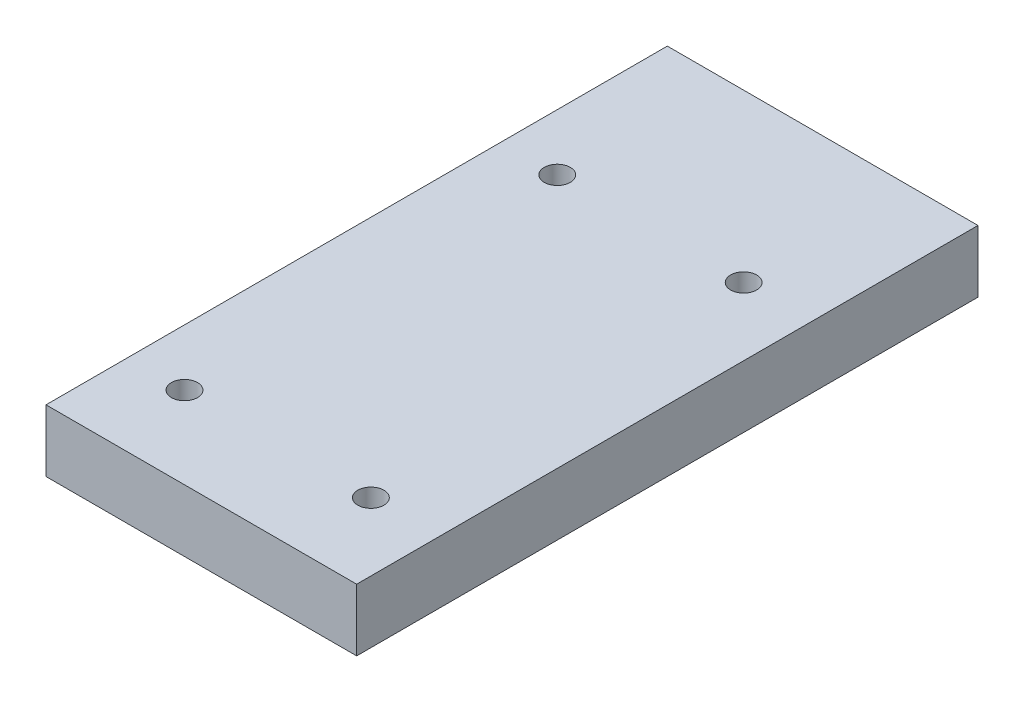
ISO-10303-21;
HEADER;
FILE_DESCRIPTION(('STEP AP214'),'2;1');
FILE_NAME('part.step','',(''),(''),'','','');
FILE_SCHEMA(('AUTOMOTIVE_DESIGN { 1 0 10303 214 1 1 1 1 }'));
ENDSEC;
DATA;
#1=APPLICATION_CONTEXT('core data for automotive mechanical design processes');
#2=APPLICATION_PROTOCOL_DEFINITION('international standard','automotive_design',2000,#1);
#3=PRODUCT_CONTEXT('',#1,'mechanical');
#4=PRODUCT('Part','Part','',(#3));
#5=PRODUCT_RELATED_PRODUCT_CATEGORY('part','',(#4));
#6=PRODUCT_DEFINITION_FORMATION('','',#4);
#7=PRODUCT_DEFINITION_CONTEXT('part definition',#1,'design');
#8=PRODUCT_DEFINITION('design','',#6,#7);
#9=PRODUCT_DEFINITION_SHAPE('','',#8);
#10=(LENGTH_UNIT() NAMED_UNIT(*) SI_UNIT(.MILLI.,.METRE.));
#11=(NAMED_UNIT(*) PLANE_ANGLE_UNIT() SI_UNIT($,.RADIAN.));
#12=(NAMED_UNIT(*) SI_UNIT($,.STERADIAN.) SOLID_ANGLE_UNIT());
#13=UNCERTAINTY_MEASURE_WITH_UNIT(LENGTH_MEASURE(1.E-05),#10,'distance_accuracy_value','');
#14=(GEOMETRIC_REPRESENTATION_CONTEXT(3) GLOBAL_UNCERTAINTY_ASSIGNED_CONTEXT((#13)) GLOBAL_UNIT_ASSIGNED_CONTEXT((#10,
#11,#12)) REPRESENTATION_CONTEXT('',''));
#15=CARTESIAN_POINT('',(0.,0.,0.));
#16=DIRECTION('',(0.,0.,1.));
#17=DIRECTION('',(1.,0.,0.));
#18=AXIS2_PLACEMENT_3D('',#15,#16,#17);
#19=CARTESIAN_POINT('',(0.,5.,0.));
#20=DIRECTION('',(1.,0.,0.));
#21=DIRECTION('',(0.,0.,-1.));
#22=AXIS2_PLACEMENT_3D('',#19,#20,#21);
#23=PLANE('',#22);
#24=DIRECTION('',(0.,0.,1.));
#25=VECTOR('',#24,1.);
#26=CARTESIAN_POINT('',(0.,0.,0.));
#27=LINE('',#26,#25);
#28=CARTESIAN_POINT('',(0.,0.,-50.));
#29=VERTEX_POINT('',#28);
#30=CARTESIAN_POINT('',(0.,0.,0.));
#31=VERTEX_POINT('',#30);
#32=EDGE_CURVE('E110',#29,#31,#27,.T.);
#33=ORIENTED_EDGE('',*,*,#32,.T.);
#34=DIRECTION('',(0.,-1.,0.));
#35=VECTOR('',#34,1.);
#36=CARTESIAN_POINT('',(0.,5.,0.));
#37=LINE('',#36,#35);
#38=CARTESIAN_POINT('',(0.,5.,0.));
#39=VERTEX_POINT('',#38);
#40=EDGE_CURVE('E11',#39,#31,#37,.T.);
#41=ORIENTED_EDGE('',*,*,#40,.F.);
#42=DIRECTION('',(0.,0.,1.));
#43=VECTOR('',#42,1.);
#44=CARTESIAN_POINT('',(0.,5.,0.));
#45=LINE('',#44,#43);
#46=CARTESIAN_POINT('',(0.,5.,-50.));
#47=VERTEX_POINT('',#46);
#48=EDGE_CURVE('E93',#47,#39,#45,.T.);
#49=ORIENTED_EDGE('',*,*,#48,.F.);
#50=DIRECTION('',(0.,-1.,0.));
#51=VECTOR('',#50,1.);
#52=CARTESIAN_POINT('',(0.,5.,-50.));
#53=LINE('',#52,#51);
#54=EDGE_CURVE('E106',#47,#29,#53,.T.);
#55=ORIENTED_EDGE('',*,*,#54,.T.);
#56=EDGE_LOOP('',(#33,#41,#49,#55));
#57=FACE_BOUND('',#56,.T.);
#58=ADVANCED_FACE('F39',(#57),#23,.F.);
#59=CARTESIAN_POINT('',(0.,5.,0.));
#60=DIRECTION('',(0.,0.,-1.));
#61=DIRECTION('',(-1.,0.,0.));
#62=AXIS2_PLACEMENT_3D('',#59,#60,#61);
#63=PLANE('',#62);
#64=DIRECTION('',(1.,0.,0.));
#65=VECTOR('',#64,1.);
#66=CARTESIAN_POINT('',(0.,0.,0.));
#67=LINE('',#66,#65);
#68=CARTESIAN_POINT('',(25.,0.,0.));
#69=VERTEX_POINT('',#68);
#70=EDGE_CURVE('E98',#31,#69,#67,.T.);
#71=ORIENTED_EDGE('',*,*,#70,.T.);
#72=DIRECTION('',(0.,-1.,0.));
#73=VECTOR('',#72,1.);
#74=CARTESIAN_POINT('',(25.,5.,0.));
#75=LINE('',#74,#73);
#76=CARTESIAN_POINT('',(25.,5.,0.));
#77=VERTEX_POINT('',#76);
#78=EDGE_CURVE('E49',#77,#69,#75,.T.);
#79=ORIENTED_EDGE('',*,*,#78,.F.);
#80=DIRECTION('',(1.,0.,0.));
#81=VECTOR('',#80,1.);
#82=CARTESIAN_POINT('',(0.,5.,0.));
#83=LINE('',#82,#81);
#84=EDGE_CURVE('E88',#39,#77,#83,.T.);
#85=ORIENTED_EDGE('',*,*,#84,.F.);
#86=ORIENTED_EDGE('',*,*,#40,.T.);
#87=EDGE_LOOP('',(#71,#79,#85,#86));
#88=FACE_BOUND('',#87,.T.);
#89=ADVANCED_FACE('F97',(#88),#63,.F.);
#90=CARTESIAN_POINT('',(25.,5.,0.));
#91=DIRECTION('',(-1.,0.,0.));
#92=DIRECTION('',(0.,0.,1.));
#93=AXIS2_PLACEMENT_3D('',#90,#91,#92);
#94=PLANE('',#93);
#95=DIRECTION('',(0.,0.,-1.));
#96=VECTOR('',#95,1.);
#97=CARTESIAN_POINT('',(25.,0.,0.));
#98=LINE('',#97,#96);
#99=CARTESIAN_POINT('',(25.,0.,-50.));
#100=VERTEX_POINT('',#99);
#101=EDGE_CURVE('E75',#69,#100,#98,.T.);
#102=ORIENTED_EDGE('',*,*,#101,.T.);
#103=DIRECTION('',(0.,-1.,0.));
#104=VECTOR('',#103,1.);
#105=CARTESIAN_POINT('',(25.,5.,-50.));
#106=LINE('',#105,#104);
#107=CARTESIAN_POINT('',(25.,5.,-50.));
#108=VERTEX_POINT('',#107);
#109=EDGE_CURVE('E100',#108,#100,#106,.T.);
#110=ORIENTED_EDGE('',*,*,#109,.F.);
#111=DIRECTION('',(0.,0.,-1.));
#112=VECTOR('',#111,1.);
#113=CARTESIAN_POINT('',(25.,5.,0.));
#114=LINE('',#113,#112);
#115=EDGE_CURVE('E91',#77,#108,#114,.T.);
#116=ORIENTED_EDGE('',*,*,#115,.F.);
#117=ORIENTED_EDGE('',*,*,#78,.T.);
#118=EDGE_LOOP('',(#102,#110,#116,#117));
#119=FACE_BOUND('',#118,.T.);
#120=ADVANCED_FACE('F102',(#119),#94,.F.);
#121=CARTESIAN_POINT('',(0.,5.,-50.));
#122=DIRECTION('',(0.,0.,1.));
#123=DIRECTION('',(1.,0.,0.));
#124=AXIS2_PLACEMENT_3D('',#121,#122,#123);
#125=PLANE('',#124);
#126=DIRECTION('',(-1.,0.,0.));
#127=VECTOR('',#126,1.);
#128=CARTESIAN_POINT('',(0.,0.,-50.));
#129=LINE('',#128,#127);
#130=EDGE_CURVE('E81',#100,#29,#129,.T.);
#131=ORIENTED_EDGE('',*,*,#130,.T.);
#132=ORIENTED_EDGE('',*,*,#54,.F.);
#133=DIRECTION('',(-1.,0.,0.));
#134=VECTOR('',#133,1.);
#135=CARTESIAN_POINT('',(0.,5.,-50.));
#136=LINE('',#135,#134);
#137=EDGE_CURVE('E58',#108,#47,#136,.T.);
#138=ORIENTED_EDGE('',*,*,#137,.F.);
#139=ORIENTED_EDGE('',*,*,#109,.T.);
#140=EDGE_LOOP('',(#131,#132,#138,#139));
#141=FACE_BOUND('',#140,.T.);
#142=ADVANCED_FACE('F156',(#141),#125,.F.);
#143=CARTESIAN_POINT('',(0.,5.,0.));
#144=DIRECTION('',(0.,-1.,0.));
#145=DIRECTION('',(0.,0.,-1.));
#146=AXIS2_PLACEMENT_3D('',#143,#144,#145);
#147=PLANE('',#146);
#148=CARTESIAN_POINT('',(19.5461500354921,5.,-6.59675696250813));
#149=DIRECTION('',(0.,1.,0.));
#150=DIRECTION('',(0.,0.,1.));
#151=AXIS2_PLACEMENT_3D('',#148,#149,#150);
#152=CIRCLE('',#151,1.05);
#153=CARTESIAN_POINT('',(19.5461500354921,5.,-5.54675696250813));
#154=VERTEX_POINT('',#153);
#155=EDGE_CURVE('E239',#154,#154,#152,.T.);
#156=ORIENTED_EDGE('',*,*,#155,.F.);
#157=EDGE_LOOP('',(#156));
#158=FACE_BOUND('',#157,.T.);
#159=CARTESIAN_POINT('',(19.5461500354921,5.,-36.5967569625081));
#160=DIRECTION('',(0.,1.,0.));
#161=DIRECTION('',(0.,0.,1.));
#162=AXIS2_PLACEMENT_3D('',#159,#160,#161);
#163=CIRCLE('',#162,1.05);
#164=CARTESIAN_POINT('',(19.5461500354921,5.,-35.5467569625081));
#165=VERTEX_POINT('',#164);
#166=EDGE_CURVE('E235',#165,#165,#163,.T.);
#167=ORIENTED_EDGE('',*,*,#166,.F.);
#168=EDGE_LOOP('',(#167));
#169=FACE_BOUND('',#168,.T.);
#170=CARTESIAN_POINT('',(4.5461500354921,5.,-36.5967569625081));
#171=DIRECTION('',(0.,1.,0.));
#172=DIRECTION('',(0.,0.,1.));
#173=AXIS2_PLACEMENT_3D('',#170,#171,#172);
#174=CIRCLE('',#173,1.05);
#175=CARTESIAN_POINT('',(4.5461500354921,5.,-35.5467569625081));
#176=VERTEX_POINT('',#175);
#177=EDGE_CURVE('E238',#176,#176,#174,.T.);
#178=ORIENTED_EDGE('',*,*,#177,.F.);
#179=EDGE_LOOP('',(#178));
#180=FACE_BOUND('',#179,.T.);
#181=CARTESIAN_POINT('',(4.5461500354921,5.,-6.59675696250812));
#182=DIRECTION('',(0.,1.,0.));
#183=DIRECTION('',(0.,0.,1.));
#184=AXIS2_PLACEMENT_3D('',#181,#182,#183);
#185=CIRCLE('',#184,1.05);
#186=CARTESIAN_POINT('',(4.5461500354921,5.,-5.54675696250812));
#187=VERTEX_POINT('',#186);
#188=EDGE_CURVE('E129',#187,#187,#185,.T.);
#189=ORIENTED_EDGE('',*,*,#188,.F.);
#190=EDGE_LOOP('',(#189));
#191=FACE_BOUND('',#190,.T.);
#192=ORIENTED_EDGE('',*,*,#48,.T.);
#193=ORIENTED_EDGE('',*,*,#84,.T.);
#194=ORIENTED_EDGE('',*,*,#115,.T.);
#195=ORIENTED_EDGE('',*,*,#137,.T.);
#196=EDGE_LOOP('',(#192,#193,#194,#195));
#197=FACE_BOUND('',#196,.T.);
#198=ADVANCED_FACE('F89',(#158,#169,#180,#191,#197),#147,.F.);
#199=CARTESIAN_POINT('',(0.,0.,0.));
#200=DIRECTION('',(0.,-1.,0.));
#201=DIRECTION('',(0.,0.,-1.));
#202=AXIS2_PLACEMENT_3D('',#199,#200,#201);
#203=PLANE('',#202);
#204=CARTESIAN_POINT('',(19.5461500354921,0.,-6.59675696250813));
#205=DIRECTION('',(0.,-1.,0.));
#206=DIRECTION('',(0.,0.,-1.));
#207=AXIS2_PLACEMENT_3D('',#204,#205,#206);
#208=CIRCLE('',#207,1.05);
#209=CARTESIAN_POINT('',(19.5461500354921,0.,-5.54675696250813));
#210=VERTEX_POINT('',#209);
#211=EDGE_CURVE('E42',#210,#210,#208,.T.);
#212=ORIENTED_EDGE('',*,*,#211,.F.);
#213=EDGE_LOOP('',(#212));
#214=FACE_BOUND('',#213,.T.);
#215=CARTESIAN_POINT('',(19.5461500354921,0.,-36.5967569625081));
#216=DIRECTION('',(0.,-1.,0.));
#217=DIRECTION('',(0.,0.,-1.));
#218=AXIS2_PLACEMENT_3D('',#215,#216,#217);
#219=CIRCLE('',#218,1.05);
#220=CARTESIAN_POINT('',(19.5461500354921,0.,-35.5467569625081));
#221=VERTEX_POINT('',#220);
#222=EDGE_CURVE('E132',#221,#221,#219,.T.);
#223=ORIENTED_EDGE('',*,*,#222,.F.);
#224=EDGE_LOOP('',(#223));
#225=FACE_BOUND('',#224,.T.);
#226=CARTESIAN_POINT('',(4.5461500354921,0.,-36.5967569625081));
#227=DIRECTION('',(0.,-1.,0.));
#228=DIRECTION('',(0.,0.,-1.));
#229=AXIS2_PLACEMENT_3D('',#226,#227,#228);
#230=CIRCLE('',#229,1.05);
#231=CARTESIAN_POINT('',(4.5461500354921,0.,-35.5467569625081));
#232=VERTEX_POINT('',#231);
#233=EDGE_CURVE('E128',#232,#232,#230,.T.);
#234=ORIENTED_EDGE('',*,*,#233,.F.);
#235=EDGE_LOOP('',(#234));
#236=FACE_BOUND('',#235,.T.);
#237=CARTESIAN_POINT('',(4.5461500354921,0.,-6.59675696250812));
#238=DIRECTION('',(0.,-1.,0.));
#239=DIRECTION('',(0.,0.,-1.));
#240=AXIS2_PLACEMENT_3D('',#237,#238,#239);
#241=CIRCLE('',#240,1.05);
#242=CARTESIAN_POINT('',(4.5461500354921,0.,-5.54675696250812));
#243=VERTEX_POINT('',#242);
#244=EDGE_CURVE('E124',#243,#243,#241,.T.);
#245=ORIENTED_EDGE('',*,*,#244,.F.);
#246=EDGE_LOOP('',(#245));
#247=FACE_BOUND('',#246,.T.);
#248=ORIENTED_EDGE('',*,*,#32,.F.);
#249=ORIENTED_EDGE('',*,*,#130,.F.);
#250=ORIENTED_EDGE('',*,*,#101,.F.);
#251=ORIENTED_EDGE('',*,*,#70,.F.);
#252=EDGE_LOOP('',(#248,#249,#250,#251));
#253=FACE_BOUND('',#252,.T.);
#254=ADVANCED_FACE('F144',(#214,#225,#236,#247,#253),#203,.T.);
#255=CARTESIAN_POINT('',(4.5461500354921,-1.2E-05,-6.59675696250812));
#256=DIRECTION('',(0.,1.,0.));
#257=DIRECTION('',(0.,0.,1.));
#258=AXIS2_PLACEMENT_3D('',#255,#256,#257);
#259=CYLINDRICAL_SURFACE('',#258,1.05);
#260=CARTESIAN_POINT('',(4.5461500354921,0.,-5.54675696250812));
#261=CARTESIAN_POINT('',(4.5461500354921,0.0520833333333333,-5.54675696250812));
#262=CARTESIAN_POINT('',(4.5461500354921,0.104166666666667,-5.54675696250812));
#263=CARTESIAN_POINT('',(4.5461500354921,0.208333333333333,-5.54675696250812));
#264=CARTESIAN_POINT('',(4.5461500354921,0.260416666666667,-5.54675696250812));
#265=CARTESIAN_POINT('',(4.5461500354921,0.364583333333333,-5.54675696250812));
#266=CARTESIAN_POINT('',(4.5461500354921,0.416666666666667,-5.54675696250812));
#267=CARTESIAN_POINT('',(4.5461500354921,0.520833333333333,-5.54675696250812));
#268=CARTESIAN_POINT('',(4.5461500354921,0.572916666666667,-5.54675696250812));
#269=CARTESIAN_POINT('',(4.5461500354921,0.677083333333333,-5.54675696250812));
#270=CARTESIAN_POINT('',(4.5461500354921,0.729166666666667,-5.54675696250812));
#271=CARTESIAN_POINT('',(4.5461500354921,0.833333333333333,-5.54675696250812));
#272=CARTESIAN_POINT('',(4.5461500354921,0.885416666666667,-5.54675696250812));
#273=CARTESIAN_POINT('',(4.5461500354921,0.989583333333333,-5.54675696250812));
#274=CARTESIAN_POINT('',(4.5461500354921,1.04166666666667,-5.54675696250812));
#275=CARTESIAN_POINT('',(4.5461500354921,1.14583333333333,-5.54675696250812));
#276=CARTESIAN_POINT('',(4.5461500354921,1.19791666666667,-5.54675696250812));
#277=CARTESIAN_POINT('',(4.5461500354921,1.30208333333333,-5.54675696250812));
#278=CARTESIAN_POINT('',(4.5461500354921,1.35416666666667,-5.54675696250812));
#279=CARTESIAN_POINT('',(4.5461500354921,1.45833333333333,-5.54675696250812));
#280=CARTESIAN_POINT('',(4.5461500354921,1.51041666666667,-5.54675696250812));
#281=CARTESIAN_POINT('',(4.5461500354921,1.61458333333333,-5.54675696250812));
#282=CARTESIAN_POINT('',(4.5461500354921,1.66666666666667,-5.54675696250812));
#283=CARTESIAN_POINT('',(4.5461500354921,1.77083333333333,-5.54675696250812));
#284=CARTESIAN_POINT('',(4.5461500354921,1.82291666666667,-5.54675696250812));
#285=CARTESIAN_POINT('',(4.5461500354921,1.92708333333333,-5.54675696250812));
#286=CARTESIAN_POINT('',(4.5461500354921,1.97916666666667,-5.54675696250812));
#287=CARTESIAN_POINT('',(4.5461500354921,2.08333333333333,-5.54675696250812));
#288=CARTESIAN_POINT('',(4.5461500354921,2.13541666666667,-5.54675696250812));
#289=CARTESIAN_POINT('',(4.5461500354921,2.23958333333333,-5.54675696250812));
#290=CARTESIAN_POINT('',(4.5461500354921,2.29166666666667,-5.54675696250812));
#291=CARTESIAN_POINT('',(4.5461500354921,2.39583333333333,-5.54675696250812));
#292=CARTESIAN_POINT('',(4.5461500354921,2.44791666666667,-5.54675696250812));
#293=CARTESIAN_POINT('',(4.5461500354921,2.55208333333333,-5.54675696250812));
#294=CARTESIAN_POINT('',(4.5461500354921,2.60416666666667,-5.54675696250812));
#295=CARTESIAN_POINT('',(4.5461500354921,2.70833333333333,-5.54675696250812));
#296=CARTESIAN_POINT('',(4.5461500354921,2.76041666666667,-5.54675696250812));
#297=CARTESIAN_POINT('',(4.5461500354921,2.86458333333333,-5.54675696250812));
#298=CARTESIAN_POINT('',(4.5461500354921,2.91666666666667,-5.54675696250812));
#299=CARTESIAN_POINT('',(4.5461500354921,3.02083333333333,-5.54675696250812));
#300=CARTESIAN_POINT('',(4.5461500354921,3.07291666666667,-5.54675696250812));
#301=CARTESIAN_POINT('',(4.5461500354921,3.17708333333333,-5.54675696250812));
#302=CARTESIAN_POINT('',(4.5461500354921,3.22916666666667,-5.54675696250812));
#303=CARTESIAN_POINT('',(4.5461500354921,3.33333333333333,-5.54675696250812));
#304=CARTESIAN_POINT('',(4.5461500354921,3.38541666666667,-5.54675696250812));
#305=CARTESIAN_POINT('',(4.5461500354921,3.48958333333333,-5.54675696250812));
#306=CARTESIAN_POINT('',(4.5461500354921,3.54166666666667,-5.54675696250812));
#307=CARTESIAN_POINT('',(4.5461500354921,3.64583333333333,-5.54675696250812));
#308=CARTESIAN_POINT('',(4.5461500354921,3.69791666666667,-5.54675696250812));
#309=CARTESIAN_POINT('',(4.5461500354921,3.80208333333333,-5.54675696250812));
#310=CARTESIAN_POINT('',(4.5461500354921,3.85416666666667,-5.54675696250812));
#311=CARTESIAN_POINT('',(4.5461500354921,3.95833333333333,-5.54675696250812));
#312=CARTESIAN_POINT('',(4.5461500354921,4.01041666666667,-5.54675696250812));
#313=CARTESIAN_POINT('',(4.5461500354921,4.11458333333333,-5.54675696250812));
#314=CARTESIAN_POINT('',(4.5461500354921,4.16666666666667,-5.54675696250812));
#315=CARTESIAN_POINT('',(4.5461500354921,4.27083333333333,-5.54675696250812));
#316=CARTESIAN_POINT('',(4.5461500354921,4.32291666666667,-5.54675696250812));
#317=CARTESIAN_POINT('',(4.5461500354921,4.42708333333333,-5.54675696250812));
#318=CARTESIAN_POINT('',(4.5461500354921,4.47916666666667,-5.54675696250812));
#319=CARTESIAN_POINT('',(4.5461500354921,4.58333333333333,-5.54675696250812));
#320=CARTESIAN_POINT('',(4.5461500354921,4.63541666666667,-5.54675696250812));
#321=CARTESIAN_POINT('',(4.5461500354921,4.73958333333333,-5.54675696250812));
#322=CARTESIAN_POINT('',(4.5461500354921,4.79166666666667,-5.54675696250812));
#323=CARTESIAN_POINT('',(4.5461500354921,4.89583333333333,-5.54675696250812));
#324=CARTESIAN_POINT('',(4.5461500354921,4.94791666666667,-5.54675696250812));
#325=CARTESIAN_POINT('',(4.5461500354921,5.,-5.54675696250812));
#326=B_SPLINE_CURVE_WITH_KNOTS('',3,(#260,#261,#262,#263,#264,#265,#266,#267,#268,#269,#270,
#271,#272,#273,#274,#275,#276,#277,#278,#279,#280,#281,#282,#283,#284,#285,#286,#287,#288,#289,
#290,#291,#292,#293,#294,#295,#296,#297,#298,#299,#300,#301,#302,#303,#304,#305,#306,#307,#308,
#309,#310,#311,#312,#313,#314,#315,#316,#317,#318,#319,#320,#321,#322,#323,#324,#325),
.UNSPECIFIED.,.F.,.F.,(4,2,2,2,2,2,2,2,2,2,2,2,2,2,2,2,2,2,2,2,2,2,2,2,2,2,2,2,2,2,2,2,4),(0.,
0.15625,0.3125,0.46875,0.625,0.78125,0.9375,1.09375,1.25,1.40625,1.5625,1.71875,1.875,2.03125,
2.1875,2.34375,2.5,2.65625,2.8125,2.96875,3.125,3.28125,3.4375,3.59375,3.75,3.90625,4.0625,
4.21875,4.375,4.53125,4.6875,4.84375,5.),.UNSPECIFIED.);
#327=EDGE_CURVE('BSEAM147',#243,#187,#326,.T.);
#328=ORIENTED_EDGE('',*,*,#244,.T.);
#329=ORIENTED_EDGE('',*,*,#188,.T.);
#330=ORIENTED_EDGE('',*,*,#327,.T.);
#331=ORIENTED_EDGE('',*,*,#327,.F.);
#332=EDGE_LOOP('',(#328,#330,#329,#331));
#333=FACE_BOUND('',#332,.T.);
#334=ADVANCED_FACE('F147',(#333),#259,.F.);
#335=CARTESIAN_POINT('',(4.5461500354921,-1.2E-05,-36.5967569625081));
#336=DIRECTION('',(0.,1.,0.));
#337=DIRECTION('',(0.,0.,1.));
#338=AXIS2_PLACEMENT_3D('',#335,#336,#337);
#339=CYLINDRICAL_SURFACE('',#338,1.05);
#340=CARTESIAN_POINT('',(4.5461500354921,0.,-35.5467569625081));
#341=CARTESIAN_POINT('',(4.5461500354921,0.0520833333333333,-35.5467569625081));
#342=CARTESIAN_POINT('',(4.5461500354921,0.104166666666667,-35.5467569625081));
#343=CARTESIAN_POINT('',(4.5461500354921,0.208333333333333,-35.5467569625081));
#344=CARTESIAN_POINT('',(4.5461500354921,0.260416666666667,-35.5467569625081));
#345=CARTESIAN_POINT('',(4.5461500354921,0.364583333333333,-35.5467569625081));
#346=CARTESIAN_POINT('',(4.5461500354921,0.416666666666667,-35.5467569625081));
#347=CARTESIAN_POINT('',(4.5461500354921,0.520833333333333,-35.5467569625081));
#348=CARTESIAN_POINT('',(4.5461500354921,0.572916666666667,-35.5467569625081));
#349=CARTESIAN_POINT('',(4.5461500354921,0.677083333333333,-35.5467569625081));
#350=CARTESIAN_POINT('',(4.5461500354921,0.729166666666667,-35.5467569625081));
#351=CARTESIAN_POINT('',(4.5461500354921,0.833333333333333,-35.5467569625081));
#352=CARTESIAN_POINT('',(4.5461500354921,0.885416666666667,-35.5467569625081));
#353=CARTESIAN_POINT('',(4.5461500354921,0.989583333333333,-35.5467569625081));
#354=CARTESIAN_POINT('',(4.5461500354921,1.04166666666667,-35.5467569625081));
#355=CARTESIAN_POINT('',(4.5461500354921,1.14583333333333,-35.5467569625081));
#356=CARTESIAN_POINT('',(4.5461500354921,1.19791666666667,-35.5467569625081));
#357=CARTESIAN_POINT('',(4.5461500354921,1.30208333333333,-35.5467569625081));
#358=CARTESIAN_POINT('',(4.5461500354921,1.35416666666667,-35.5467569625081));
#359=CARTESIAN_POINT('',(4.5461500354921,1.45833333333333,-35.5467569625081));
#360=CARTESIAN_POINT('',(4.5461500354921,1.51041666666667,-35.5467569625081));
#361=CARTESIAN_POINT('',(4.5461500354921,1.61458333333333,-35.5467569625081));
#362=CARTESIAN_POINT('',(4.5461500354921,1.66666666666667,-35.5467569625081));
#363=CARTESIAN_POINT('',(4.5461500354921,1.77083333333333,-35.5467569625081));
#364=CARTESIAN_POINT('',(4.5461500354921,1.82291666666667,-35.5467569625081));
#365=CARTESIAN_POINT('',(4.5461500354921,1.92708333333333,-35.5467569625081));
#366=CARTESIAN_POINT('',(4.5461500354921,1.97916666666667,-35.5467569625081));
#367=CARTESIAN_POINT('',(4.5461500354921,2.08333333333333,-35.5467569625081));
#368=CARTESIAN_POINT('',(4.5461500354921,2.13541666666667,-35.5467569625081));
#369=CARTESIAN_POINT('',(4.5461500354921,2.23958333333333,-35.5467569625081));
#370=CARTESIAN_POINT('',(4.5461500354921,2.29166666666667,-35.5467569625081));
#371=CARTESIAN_POINT('',(4.5461500354921,2.39583333333333,-35.5467569625081));
#372=CARTESIAN_POINT('',(4.5461500354921,2.44791666666667,-35.5467569625081));
#373=CARTESIAN_POINT('',(4.5461500354921,2.55208333333333,-35.5467569625081));
#374=CARTESIAN_POINT('',(4.5461500354921,2.60416666666667,-35.5467569625081));
#375=CARTESIAN_POINT('',(4.5461500354921,2.70833333333333,-35.5467569625081));
#376=CARTESIAN_POINT('',(4.5461500354921,2.76041666666667,-35.5467569625081));
#377=CARTESIAN_POINT('',(4.5461500354921,2.86458333333333,-35.5467569625081));
#378=CARTESIAN_POINT('',(4.5461500354921,2.91666666666667,-35.5467569625081));
#379=CARTESIAN_POINT('',(4.5461500354921,3.02083333333333,-35.5467569625081));
#380=CARTESIAN_POINT('',(4.5461500354921,3.07291666666667,-35.5467569625081));
#381=CARTESIAN_POINT('',(4.5461500354921,3.17708333333333,-35.5467569625081));
#382=CARTESIAN_POINT('',(4.5461500354921,3.22916666666667,-35.5467569625081));
#383=CARTESIAN_POINT('',(4.5461500354921,3.33333333333333,-35.5467569625081));
#384=CARTESIAN_POINT('',(4.5461500354921,3.38541666666667,-35.5467569625081));
#385=CARTESIAN_POINT('',(4.5461500354921,3.48958333333333,-35.5467569625081));
#386=CARTESIAN_POINT('',(4.5461500354921,3.54166666666667,-35.5467569625081));
#387=CARTESIAN_POINT('',(4.5461500354921,3.64583333333333,-35.5467569625081));
#388=CARTESIAN_POINT('',(4.5461500354921,3.69791666666667,-35.5467569625081));
#389=CARTESIAN_POINT('',(4.5461500354921,3.80208333333333,-35.5467569625081));
#390=CARTESIAN_POINT('',(4.5461500354921,3.85416666666667,-35.5467569625081));
#391=CARTESIAN_POINT('',(4.5461500354921,3.95833333333333,-35.5467569625081));
#392=CARTESIAN_POINT('',(4.5461500354921,4.01041666666667,-35.5467569625081));
#393=CARTESIAN_POINT('',(4.5461500354921,4.11458333333333,-35.5467569625081));
#394=CARTESIAN_POINT('',(4.5461500354921,4.16666666666667,-35.5467569625081));
#395=CARTESIAN_POINT('',(4.5461500354921,4.27083333333333,-35.5467569625081));
#396=CARTESIAN_POINT('',(4.5461500354921,4.32291666666667,-35.5467569625081));
#397=CARTESIAN_POINT('',(4.5461500354921,4.42708333333333,-35.5467569625081));
#398=CARTESIAN_POINT('',(4.5461500354921,4.47916666666667,-35.5467569625081));
#399=CARTESIAN_POINT('',(4.5461500354921,4.58333333333333,-35.5467569625081));
#400=CARTESIAN_POINT('',(4.5461500354921,4.63541666666667,-35.5467569625081));
#401=CARTESIAN_POINT('',(4.5461500354921,4.73958333333333,-35.5467569625081));
#402=CARTESIAN_POINT('',(4.5461500354921,4.79166666666667,-35.5467569625081));
#403=CARTESIAN_POINT('',(4.5461500354921,4.89583333333333,-35.5467569625081));
#404=CARTESIAN_POINT('',(4.5461500354921,4.94791666666667,-35.5467569625081));
#405=CARTESIAN_POINT('',(4.5461500354921,5.,-35.5467569625081));
#406=B_SPLINE_CURVE_WITH_KNOTS('',3,(#340,#341,#342,#343,#344,#345,#346,#347,#348,#349,#350,
#351,#352,#353,#354,#355,#356,#357,#358,#359,#360,#361,#362,#363,#364,#365,#366,#367,#368,#369,
#370,#371,#372,#373,#374,#375,#376,#377,#378,#379,#380,#381,#382,#383,#384,#385,#386,#387,#388,
#389,#390,#391,#392,#393,#394,#395,#396,#397,#398,#399,#400,#401,#402,#403,#404,#405),
.UNSPECIFIED.,.F.,.F.,(4,2,2,2,2,2,2,2,2,2,2,2,2,2,2,2,2,2,2,2,2,2,2,2,2,2,2,2,2,2,2,2,4),(0.,
0.15625,0.3125,0.46875,0.625,0.78125,0.9375,1.09375,1.25,1.40625,1.5625,1.71875,1.875,2.03125,
2.1875,2.34375,2.5,2.65625,2.8125,2.96875,3.125,3.28125,3.4375,3.59375,3.75,3.90625,4.0625,
4.21875,4.375,4.53125,4.6875,4.84375,5.),.UNSPECIFIED.);
#407=EDGE_CURVE('BSEAM201',#232,#176,#406,.T.);
#408=ORIENTED_EDGE('',*,*,#233,.T.);
#409=ORIENTED_EDGE('',*,*,#177,.T.);
#410=ORIENTED_EDGE('',*,*,#407,.T.);
#411=ORIENTED_EDGE('',*,*,#407,.F.);
#412=EDGE_LOOP('',(#408,#410,#409,#411));
#413=FACE_BOUND('',#412,.T.);
#414=ADVANCED_FACE('F201',(#413),#339,.F.);
#415=CARTESIAN_POINT('',(19.5461500354921,-1.2E-05,-36.5967569625081));
#416=DIRECTION('',(0.,1.,0.));
#417=DIRECTION('',(0.,0.,1.));
#418=AXIS2_PLACEMENT_3D('',#415,#416,#417);
#419=CYLINDRICAL_SURFACE('',#418,1.05);
#420=CARTESIAN_POINT('',(19.5461500354921,0.,-35.5467569625081));
#421=CARTESIAN_POINT('',(19.5461500354921,0.0520833333333333,-35.5467569625081));
#422=CARTESIAN_POINT('',(19.5461500354921,0.104166666666667,-35.5467569625081));
#423=CARTESIAN_POINT('',(19.5461500354921,0.208333333333333,-35.5467569625081));
#424=CARTESIAN_POINT('',(19.5461500354921,0.260416666666667,-35.5467569625081));
#425=CARTESIAN_POINT('',(19.5461500354921,0.364583333333333,-35.5467569625081));
#426=CARTESIAN_POINT('',(19.5461500354921,0.416666666666667,-35.5467569625081));
#427=CARTESIAN_POINT('',(19.5461500354921,0.520833333333333,-35.5467569625081));
#428=CARTESIAN_POINT('',(19.5461500354921,0.572916666666667,-35.5467569625081));
#429=CARTESIAN_POINT('',(19.5461500354921,0.677083333333333,-35.5467569625081));
#430=CARTESIAN_POINT('',(19.5461500354921,0.729166666666667,-35.5467569625081));
#431=CARTESIAN_POINT('',(19.5461500354921,0.833333333333333,-35.5467569625081));
#432=CARTESIAN_POINT('',(19.5461500354921,0.885416666666667,-35.5467569625081));
#433=CARTESIAN_POINT('',(19.5461500354921,0.989583333333333,-35.5467569625081));
#434=CARTESIAN_POINT('',(19.5461500354921,1.04166666666667,-35.5467569625081));
#435=CARTESIAN_POINT('',(19.5461500354921,1.14583333333333,-35.5467569625081));
#436=CARTESIAN_POINT('',(19.5461500354921,1.19791666666667,-35.5467569625081));
#437=CARTESIAN_POINT('',(19.5461500354921,1.30208333333333,-35.5467569625081));
#438=CARTESIAN_POINT('',(19.5461500354921,1.35416666666667,-35.5467569625081));
#439=CARTESIAN_POINT('',(19.5461500354921,1.45833333333333,-35.5467569625081));
#440=CARTESIAN_POINT('',(19.5461500354921,1.51041666666667,-35.5467569625081));
#441=CARTESIAN_POINT('',(19.5461500354921,1.61458333333333,-35.5467569625081));
#442=CARTESIAN_POINT('',(19.5461500354921,1.66666666666667,-35.5467569625081));
#443=CARTESIAN_POINT('',(19.5461500354921,1.77083333333333,-35.5467569625081));
#444=CARTESIAN_POINT('',(19.5461500354921,1.82291666666667,-35.5467569625081));
#445=CARTESIAN_POINT('',(19.5461500354921,1.92708333333333,-35.5467569625081));
#446=CARTESIAN_POINT('',(19.5461500354921,1.97916666666667,-35.5467569625081));
#447=CARTESIAN_POINT('',(19.5461500354921,2.08333333333333,-35.5467569625081));
#448=CARTESIAN_POINT('',(19.5461500354921,2.13541666666667,-35.5467569625081));
#449=CARTESIAN_POINT('',(19.5461500354921,2.23958333333333,-35.5467569625081));
#450=CARTESIAN_POINT('',(19.5461500354921,2.29166666666667,-35.5467569625081));
#451=CARTESIAN_POINT('',(19.5461500354921,2.39583333333333,-35.5467569625081));
#452=CARTESIAN_POINT('',(19.5461500354921,2.44791666666667,-35.5467569625081));
#453=CARTESIAN_POINT('',(19.5461500354921,2.55208333333333,-35.5467569625081));
#454=CARTESIAN_POINT('',(19.5461500354921,2.60416666666667,-35.5467569625081));
#455=CARTESIAN_POINT('',(19.5461500354921,2.70833333333333,-35.5467569625081));
#456=CARTESIAN_POINT('',(19.5461500354921,2.76041666666667,-35.5467569625081));
#457=CARTESIAN_POINT('',(19.5461500354921,2.86458333333333,-35.5467569625081));
#458=CARTESIAN_POINT('',(19.5461500354921,2.91666666666667,-35.5467569625081));
#459=CARTESIAN_POINT('',(19.5461500354921,3.02083333333333,-35.5467569625081));
#460=CARTESIAN_POINT('',(19.5461500354921,3.07291666666667,-35.5467569625081));
#461=CARTESIAN_POINT('',(19.5461500354921,3.17708333333333,-35.5467569625081));
#462=CARTESIAN_POINT('',(19.5461500354921,3.22916666666667,-35.5467569625081));
#463=CARTESIAN_POINT('',(19.5461500354921,3.33333333333333,-35.5467569625081));
#464=CARTESIAN_POINT('',(19.5461500354921,3.38541666666667,-35.5467569625081));
#465=CARTESIAN_POINT('',(19.5461500354921,3.48958333333333,-35.5467569625081));
#466=CARTESIAN_POINT('',(19.5461500354921,3.54166666666667,-35.5467569625081));
#467=CARTESIAN_POINT('',(19.5461500354921,3.64583333333333,-35.5467569625081));
#468=CARTESIAN_POINT('',(19.5461500354921,3.69791666666667,-35.5467569625081));
#469=CARTESIAN_POINT('',(19.5461500354921,3.80208333333333,-35.5467569625081));
#470=CARTESIAN_POINT('',(19.5461500354921,3.85416666666667,-35.5467569625081));
#471=CARTESIAN_POINT('',(19.5461500354921,3.95833333333333,-35.5467569625081));
#472=CARTESIAN_POINT('',(19.5461500354921,4.01041666666667,-35.5467569625081));
#473=CARTESIAN_POINT('',(19.5461500354921,4.11458333333333,-35.5467569625081));
#474=CARTESIAN_POINT('',(19.5461500354921,4.16666666666667,-35.5467569625081));
#475=CARTESIAN_POINT('',(19.5461500354921,4.27083333333333,-35.5467569625081));
#476=CARTESIAN_POINT('',(19.5461500354921,4.32291666666667,-35.5467569625081));
#477=CARTESIAN_POINT('',(19.5461500354921,4.42708333333333,-35.5467569625081));
#478=CARTESIAN_POINT('',(19.5461500354921,4.47916666666667,-35.5467569625081));
#479=CARTESIAN_POINT('',(19.5461500354921,4.58333333333333,-35.5467569625081));
#480=CARTESIAN_POINT('',(19.5461500354921,4.63541666666667,-35.5467569625081));
#481=CARTESIAN_POINT('',(19.5461500354921,4.73958333333333,-35.5467569625081));
#482=CARTESIAN_POINT('',(19.5461500354921,4.79166666666667,-35.5467569625081));
#483=CARTESIAN_POINT('',(19.5461500354921,4.89583333333333,-35.5467569625081));
#484=CARTESIAN_POINT('',(19.5461500354921,4.94791666666667,-35.5467569625081));
#485=CARTESIAN_POINT('',(19.5461500354921,5.,-35.5467569625081));
#486=B_SPLINE_CURVE_WITH_KNOTS('',3,(#420,#421,#422,#423,#424,#425,#426,#427,#428,#429,#430,
#431,#432,#433,#434,#435,#436,#437,#438,#439,#440,#441,#442,#443,#444,#445,#446,#447,#448,#449,
#450,#451,#452,#453,#454,#455,#456,#457,#458,#459,#460,#461,#462,#463,#464,#465,#466,#467,#468,
#469,#470,#471,#472,#473,#474,#475,#476,#477,#478,#479,#480,#481,#482,#483,#484,#485),
.UNSPECIFIED.,.F.,.F.,(4,2,2,2,2,2,2,2,2,2,2,2,2,2,2,2,2,2,2,2,2,2,2,2,2,2,2,2,2,2,2,2,4),(0.,
0.15625,0.3125,0.46875,0.625,0.78125,0.9375,1.09375,1.25,1.40625,1.5625,1.71875,1.875,2.03125,
2.1875,2.34375,2.5,2.65625,2.8125,2.96875,3.125,3.28125,3.4375,3.59375,3.75,3.90625,4.0625,
4.21875,4.375,4.53125,4.6875,4.84375,5.),.UNSPECIFIED.);
#487=EDGE_CURVE('BSEAM211',#221,#165,#486,.T.);
#488=ORIENTED_EDGE('',*,*,#222,.T.);
#489=ORIENTED_EDGE('',*,*,#166,.T.);
#490=ORIENTED_EDGE('',*,*,#487,.T.);
#491=ORIENTED_EDGE('',*,*,#487,.F.);
#492=EDGE_LOOP('',(#488,#490,#489,#491));
#493=FACE_BOUND('',#492,.T.);
#494=ADVANCED_FACE('F211',(#493),#419,.F.);
#495=CARTESIAN_POINT('',(19.5461500354921,-1.2E-05,-6.59675696250813));
#496=DIRECTION('',(0.,1.,0.));
#497=DIRECTION('',(0.,0.,1.));
#498=AXIS2_PLACEMENT_3D('',#495,#496,#497);
#499=CYLINDRICAL_SURFACE('',#498,1.05);
#500=CARTESIAN_POINT('',(19.5461500354921,0.,-5.54675696250813));
#501=CARTESIAN_POINT('',(19.5461500354921,0.0520833333333333,-5.54675696250813));
#502=CARTESIAN_POINT('',(19.5461500354921,0.104166666666667,-5.54675696250813));
#503=CARTESIAN_POINT('',(19.5461500354921,0.208333333333333,-5.54675696250813));
#504=CARTESIAN_POINT('',(19.5461500354921,0.260416666666667,-5.54675696250813));
#505=CARTESIAN_POINT('',(19.5461500354921,0.364583333333333,-5.54675696250813));
#506=CARTESIAN_POINT('',(19.5461500354921,0.416666666666667,-5.54675696250813));
#507=CARTESIAN_POINT('',(19.5461500354921,0.520833333333333,-5.54675696250813));
#508=CARTESIAN_POINT('',(19.5461500354921,0.572916666666667,-5.54675696250813));
#509=CARTESIAN_POINT('',(19.5461500354921,0.677083333333333,-5.54675696250813));
#510=CARTESIAN_POINT('',(19.5461500354921,0.729166666666667,-5.54675696250813));
#511=CARTESIAN_POINT('',(19.5461500354921,0.833333333333333,-5.54675696250813));
#512=CARTESIAN_POINT('',(19.5461500354921,0.885416666666667,-5.54675696250813));
#513=CARTESIAN_POINT('',(19.5461500354921,0.989583333333333,-5.54675696250813));
#514=CARTESIAN_POINT('',(19.5461500354921,1.04166666666667,-5.54675696250813));
#515=CARTESIAN_POINT('',(19.5461500354921,1.14583333333333,-5.54675696250813));
#516=CARTESIAN_POINT('',(19.5461500354921,1.19791666666667,-5.54675696250813));
#517=CARTESIAN_POINT('',(19.5461500354921,1.30208333333333,-5.54675696250813));
#518=CARTESIAN_POINT('',(19.5461500354921,1.35416666666667,-5.54675696250813));
#519=CARTESIAN_POINT('',(19.5461500354921,1.45833333333333,-5.54675696250813));
#520=CARTESIAN_POINT('',(19.5461500354921,1.51041666666667,-5.54675696250813));
#521=CARTESIAN_POINT('',(19.5461500354921,1.61458333333333,-5.54675696250813));
#522=CARTESIAN_POINT('',(19.5461500354921,1.66666666666667,-5.54675696250813));
#523=CARTESIAN_POINT('',(19.5461500354921,1.77083333333333,-5.54675696250813));
#524=CARTESIAN_POINT('',(19.5461500354921,1.82291666666667,-5.54675696250813));
#525=CARTESIAN_POINT('',(19.5461500354921,1.92708333333333,-5.54675696250813));
#526=CARTESIAN_POINT('',(19.5461500354921,1.97916666666667,-5.54675696250813));
#527=CARTESIAN_POINT('',(19.5461500354921,2.08333333333333,-5.54675696250813));
#528=CARTESIAN_POINT('',(19.5461500354921,2.13541666666667,-5.54675696250813));
#529=CARTESIAN_POINT('',(19.5461500354921,2.23958333333333,-5.54675696250813));
#530=CARTESIAN_POINT('',(19.5461500354921,2.29166666666667,-5.54675696250813));
#531=CARTESIAN_POINT('',(19.5461500354921,2.39583333333333,-5.54675696250813));
#532=CARTESIAN_POINT('',(19.5461500354921,2.44791666666667,-5.54675696250813));
#533=CARTESIAN_POINT('',(19.5461500354921,2.55208333333333,-5.54675696250813));
#534=CARTESIAN_POINT('',(19.5461500354921,2.60416666666667,-5.54675696250813));
#535=CARTESIAN_POINT('',(19.5461500354921,2.70833333333333,-5.54675696250813));
#536=CARTESIAN_POINT('',(19.5461500354921,2.76041666666667,-5.54675696250813));
#537=CARTESIAN_POINT('',(19.5461500354921,2.86458333333333,-5.54675696250813));
#538=CARTESIAN_POINT('',(19.5461500354921,2.91666666666667,-5.54675696250813));
#539=CARTESIAN_POINT('',(19.5461500354921,3.02083333333333,-5.54675696250813));
#540=CARTESIAN_POINT('',(19.5461500354921,3.07291666666667,-5.54675696250813));
#541=CARTESIAN_POINT('',(19.5461500354921,3.17708333333333,-5.54675696250813));
#542=CARTESIAN_POINT('',(19.5461500354921,3.22916666666667,-5.54675696250813));
#543=CARTESIAN_POINT('',(19.5461500354921,3.33333333333333,-5.54675696250813));
#544=CARTESIAN_POINT('',(19.5461500354921,3.38541666666667,-5.54675696250813));
#545=CARTESIAN_POINT('',(19.5461500354921,3.48958333333333,-5.54675696250813));
#546=CARTESIAN_POINT('',(19.5461500354921,3.54166666666667,-5.54675696250813));
#547=CARTESIAN_POINT('',(19.5461500354921,3.64583333333333,-5.54675696250813));
#548=CARTESIAN_POINT('',(19.5461500354921,3.69791666666667,-5.54675696250813));
#549=CARTESIAN_POINT('',(19.5461500354921,3.80208333333333,-5.54675696250813));
#550=CARTESIAN_POINT('',(19.5461500354921,3.85416666666667,-5.54675696250813));
#551=CARTESIAN_POINT('',(19.5461500354921,3.95833333333333,-5.54675696250813));
#552=CARTESIAN_POINT('',(19.5461500354921,4.01041666666667,-5.54675696250813));
#553=CARTESIAN_POINT('',(19.5461500354921,4.11458333333333,-5.54675696250813));
#554=CARTESIAN_POINT('',(19.5461500354921,4.16666666666667,-5.54675696250813));
#555=CARTESIAN_POINT('',(19.5461500354921,4.27083333333333,-5.54675696250813));
#556=CARTESIAN_POINT('',(19.5461500354921,4.32291666666667,-5.54675696250813));
#557=CARTESIAN_POINT('',(19.5461500354921,4.42708333333333,-5.54675696250813));
#558=CARTESIAN_POINT('',(19.5461500354921,4.47916666666667,-5.54675696250813));
#559=CARTESIAN_POINT('',(19.5461500354921,4.58333333333333,-5.54675696250813));
#560=CARTESIAN_POINT('',(19.5461500354921,4.63541666666667,-5.54675696250813));
#561=CARTESIAN_POINT('',(19.5461500354921,4.73958333333333,-5.54675696250813));
#562=CARTESIAN_POINT('',(19.5461500354921,4.79166666666667,-5.54675696250813));
#563=CARTESIAN_POINT('',(19.5461500354921,4.89583333333333,-5.54675696250813));
#564=CARTESIAN_POINT('',(19.5461500354921,4.94791666666667,-5.54675696250813));
#565=CARTESIAN_POINT('',(19.5461500354921,5.,-5.54675696250813));
#566=B_SPLINE_CURVE_WITH_KNOTS('',3,(#500,#501,#502,#503,#504,#505,#506,#507,#508,#509,#510,
#511,#512,#513,#514,#515,#516,#517,#518,#519,#520,#521,#522,#523,#524,#525,#526,#527,#528,#529,
#530,#531,#532,#533,#534,#535,#536,#537,#538,#539,#540,#541,#542,#543,#544,#545,#546,#547,#548,
#549,#550,#551,#552,#553,#554,#555,#556,#557,#558,#559,#560,#561,#562,#563,#564,#565),
.UNSPECIFIED.,.F.,.F.,(4,2,2,2,2,2,2,2,2,2,2,2,2,2,2,2,2,2,2,2,2,2,2,2,2,2,2,2,2,2,2,2,4),(0.,
0.15625,0.3125,0.46875,0.625,0.78125,0.9375,1.09375,1.25,1.40625,1.5625,1.71875,1.875,2.03125,
2.1875,2.34375,2.5,2.65625,2.8125,2.96875,3.125,3.28125,3.4375,3.59375,3.75,3.90625,4.0625,
4.21875,4.375,4.53125,4.6875,4.84375,5.),.UNSPECIFIED.);
#567=EDGE_CURVE('BSEAM141',#210,#154,#566,.T.);
#568=ORIENTED_EDGE('',*,*,#211,.T.);
#569=ORIENTED_EDGE('',*,*,#155,.T.);
#570=ORIENTED_EDGE('',*,*,#567,.T.);
#571=ORIENTED_EDGE('',*,*,#567,.F.);
#572=EDGE_LOOP('',(#568,#570,#569,#571));
#573=FACE_BOUND('',#572,.T.);
#574=ADVANCED_FACE('F141',(#573),#499,.F.);
#575=CLOSED_SHELL('',(#58,#89,#120,#142,#198,#254,#334,#414,#494,#574));
#576=MANIFOLD_SOLID_BREP('B2',#575);
#577=ADVANCED_BREP_SHAPE_REPRESENTATION('',(#18,#576),#14);
#578=SHAPE_DEFINITION_REPRESENTATION(#9,#577);
ENDSEC;
END-ISO-10303-21;
